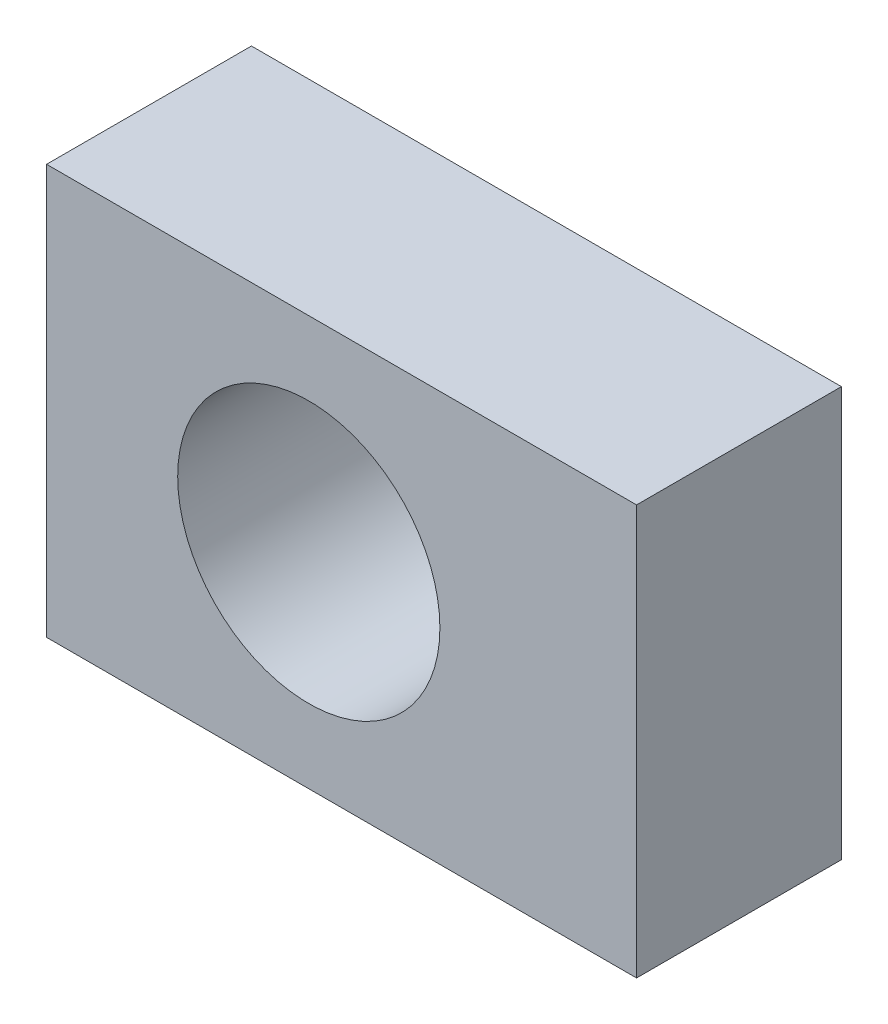
ISO-10303-21;
HEADER;
FILE_DESCRIPTION(('STEP AP214'),'2;1');
FILE_NAME('part.step','',(''),(''),'','','');
FILE_SCHEMA(('AUTOMOTIVE_DESIGN { 1 0 10303 214 1 1 1 1 }'));
ENDSEC;
DATA;
#1=APPLICATION_CONTEXT('core data for automotive mechanical design processes');
#2=APPLICATION_PROTOCOL_DEFINITION('international standard','automotive_design',2000,#1);
#3=PRODUCT_CONTEXT('',#1,'mechanical');
#4=PRODUCT('Part','Part','',(#3));
#5=PRODUCT_RELATED_PRODUCT_CATEGORY('part','',(#4));
#6=PRODUCT_DEFINITION_FORMATION('','',#4);
#7=PRODUCT_DEFINITION_CONTEXT('part definition',#1,'design');
#8=PRODUCT_DEFINITION('design','',#6,#7);
#9=PRODUCT_DEFINITION_SHAPE('','',#8);
#10=(LENGTH_UNIT() NAMED_UNIT(*) SI_UNIT(.MILLI.,.METRE.));
#11=(NAMED_UNIT(*) PLANE_ANGLE_UNIT() SI_UNIT($,.RADIAN.));
#12=(NAMED_UNIT(*) SI_UNIT($,.STERADIAN.) SOLID_ANGLE_UNIT());
#13=UNCERTAINTY_MEASURE_WITH_UNIT(LENGTH_MEASURE(1.E-05),#10,'distance_accuracy_value','');
#14=(GEOMETRIC_REPRESENTATION_CONTEXT(3) GLOBAL_UNCERTAINTY_ASSIGNED_CONTEXT((#13)) GLOBAL_UNIT_ASSIGNED_CONTEXT((#10,
#11,#12)) REPRESENTATION_CONTEXT('',''));
#15=CARTESIAN_POINT('',(0.,0.,0.));
#16=DIRECTION('',(0.,0.,1.));
#17=DIRECTION('',(1.,0.,0.));
#18=AXIS2_PLACEMENT_3D('',#15,#16,#17);
#19=CARTESIAN_POINT('',(0.,0.,3.175));
#20=DIRECTION('',(0.,0.,1.));
#21=DIRECTION('',(1.,0.,0.));
#22=AXIS2_PLACEMENT_3D('',#19,#20,#21);
#23=PLANE('',#22);
#24=DIRECTION('',(0.,-1.,0.));
#25=VECTOR('',#24,1.);
#26=CARTESIAN_POINT('',(0.,0.,3.175));
#27=LINE('',#26,#25);
#28=CARTESIAN_POINT('',(0.,0.,3.175));
#29=VERTEX_POINT('',#28);
#30=CARTESIAN_POINT('',(0.,-6.35,3.175));
#31=VERTEX_POINT('',#30);
#32=EDGE_CURVE('E85',#29,#31,#27,.T.);
#33=ORIENTED_EDGE('',*,*,#32,.T.);
#34=DIRECTION('',(1.,0.,0.));
#35=VECTOR('',#34,1.);
#36=CARTESIAN_POINT('',(0.,-6.35,3.175));
#37=LINE('',#36,#35);
#38=CARTESIAN_POINT('',(9.144,-6.35,3.175));
#39=VERTEX_POINT('',#38);
#40=EDGE_CURVE('E80',#31,#39,#37,.T.);
#41=ORIENTED_EDGE('',*,*,#40,.T.);
#42=DIRECTION('',(0.,1.,0.));
#43=VECTOR('',#42,1.);
#44=CARTESIAN_POINT('',(9.144,0.,3.175));
#45=LINE('',#44,#43);
#46=CARTESIAN_POINT('',(9.144,0.,3.175));
#47=VERTEX_POINT('',#46);
#48=EDGE_CURVE('E83',#39,#47,#45,.T.);
#49=ORIENTED_EDGE('',*,*,#48,.T.);
#50=DIRECTION('',(-1.,0.,0.));
#51=VECTOR('',#50,1.);
#52=CARTESIAN_POINT('',(0.,0.,3.175));
#53=LINE('',#52,#51);
#54=EDGE_CURVE('E50',#47,#29,#53,.T.);
#55=ORIENTED_EDGE('',*,*,#54,.T.);
#56=EDGE_LOOP('',(#33,#41,#49,#55));
#57=FACE_BOUND('',#56,.T.);
#58=CARTESIAN_POINT('',(4.064,-3.175,3.175));
#59=DIRECTION('',(0.,0.,1.));
#60=DIRECTION('',(1.,0.,0.));
#61=AXIS2_PLACEMENT_3D('',#58,#59,#60);
#62=CIRCLE('',#61,2.032);
#63=CARTESIAN_POINT('',(6.096,-3.175,3.175));
#64=VERTEX_POINT('',#63);
#65=EDGE_CURVE('E100',#64,#64,#62,.T.);
#66=ORIENTED_EDGE('',*,*,#65,.F.);
#67=EDGE_LOOP('',(#66));
#68=FACE_BOUND('',#67,.T.);
#69=ADVANCED_FACE('F33',(#57,#68),#23,.T.);
#70=CARTESIAN_POINT('',(0.,0.,0.));
#71=DIRECTION('',(0.,0.,1.));
#72=DIRECTION('',(1.,0.,0.));
#73=AXIS2_PLACEMENT_3D('',#70,#71,#72);
#74=PLANE('',#73);
#75=DIRECTION('',(0.,-1.,0.));
#76=VECTOR('',#75,1.);
#77=CARTESIAN_POINT('',(0.,0.,0.));
#78=LINE('',#77,#76);
#79=CARTESIAN_POINT('',(0.,0.,0.));
#80=VERTEX_POINT('',#79);
#81=CARTESIAN_POINT('',(0.,-6.35,0.));
#82=VERTEX_POINT('',#81);
#83=EDGE_CURVE('E97',#80,#82,#78,.T.);
#84=ORIENTED_EDGE('',*,*,#83,.F.);
#85=DIRECTION('',(-1.,0.,0.));
#86=VECTOR('',#85,1.);
#87=CARTESIAN_POINT('',(0.,0.,0.));
#88=LINE('',#87,#86);
#89=CARTESIAN_POINT('',(9.144,0.,0.));
#90=VERTEX_POINT('',#89);
#91=EDGE_CURVE('E73',#90,#80,#88,.T.);
#92=ORIENTED_EDGE('',*,*,#91,.F.);
#93=DIRECTION('',(0.,1.,0.));
#94=VECTOR('',#93,1.);
#95=CARTESIAN_POINT('',(9.144,0.,0.));
#96=LINE('',#95,#94);
#97=CARTESIAN_POINT('',(9.144,-6.35,0.));
#98=VERTEX_POINT('',#97);
#99=EDGE_CURVE('E67',#98,#90,#96,.T.);
#100=ORIENTED_EDGE('',*,*,#99,.F.);
#101=DIRECTION('',(1.,0.,0.));
#102=VECTOR('',#101,1.);
#103=CARTESIAN_POINT('',(0.,-6.35,0.));
#104=LINE('',#103,#102);
#105=EDGE_CURVE('E89',#82,#98,#104,.T.);
#106=ORIENTED_EDGE('',*,*,#105,.F.);
#107=EDGE_LOOP('',(#84,#92,#100,#106));
#108=FACE_BOUND('',#107,.T.);
#109=CARTESIAN_POINT('',(4.064,-3.175,0.));
#110=DIRECTION('',(0.,0.,1.));
#111=DIRECTION('',(1.,0.,0.));
#112=AXIS2_PLACEMENT_3D('',#109,#110,#111);
#113=CIRCLE('',#112,2.032);
#114=CARTESIAN_POINT('',(6.096,-3.175,0.));
#115=VERTEX_POINT('',#114);
#116=EDGE_CURVE('E112',#115,#115,#113,.T.);
#117=ORIENTED_EDGE('',*,*,#116,.T.);
#118=EDGE_LOOP('',(#117));
#119=FACE_BOUND('',#118,.T.);
#120=ADVANCED_FACE('F108',(#108,#119),#74,.F.);
#121=CARTESIAN_POINT('',(0.,0.,3.175));
#122=DIRECTION('',(1.,0.,0.));
#123=DIRECTION('',(0.,1.,0.));
#124=AXIS2_PLACEMENT_3D('',#121,#122,#123);
#125=PLANE('',#124);
#126=ORIENTED_EDGE('',*,*,#83,.T.);
#127=DIRECTION('',(0.,0.,-1.));
#128=VECTOR('',#127,1.);
#129=CARTESIAN_POINT('',(0.,-6.35,3.175));
#130=LINE('',#129,#128);
#131=EDGE_CURVE('E11',#31,#82,#130,.T.);
#132=ORIENTED_EDGE('',*,*,#131,.F.);
#133=ORIENTED_EDGE('',*,*,#32,.F.);
#134=DIRECTION('',(0.,0.,-1.));
#135=VECTOR('',#134,1.);
#136=CARTESIAN_POINT('',(0.,0.,3.175));
#137=LINE('',#136,#135);
#138=EDGE_CURVE('E93',#29,#80,#137,.T.);
#139=ORIENTED_EDGE('',*,*,#138,.T.);
#140=EDGE_LOOP('',(#126,#132,#133,#139));
#141=FACE_BOUND('',#140,.T.);
#142=ADVANCED_FACE('F35',(#141),#125,.F.);
#143=CARTESIAN_POINT('',(0.,-6.35,3.175));
#144=DIRECTION('',(0.,1.,0.));
#145=DIRECTION('',(0.,0.,1.));
#146=AXIS2_PLACEMENT_3D('',#143,#144,#145);
#147=PLANE('',#146);
#148=ORIENTED_EDGE('',*,*,#105,.T.);
#149=DIRECTION('',(0.,0.,-1.));
#150=VECTOR('',#149,1.);
#151=CARTESIAN_POINT('',(9.144,-6.35,3.175));
#152=LINE('',#151,#150);
#153=EDGE_CURVE('E42',#39,#98,#152,.T.);
#154=ORIENTED_EDGE('',*,*,#153,.F.);
#155=ORIENTED_EDGE('',*,*,#40,.F.);
#156=ORIENTED_EDGE('',*,*,#131,.T.);
#157=EDGE_LOOP('',(#148,#154,#155,#156));
#158=FACE_BOUND('',#157,.T.);
#159=ADVANCED_FACE('F88',(#158),#147,.F.);
#160=CARTESIAN_POINT('',(9.144,0.,3.175));
#161=DIRECTION('',(-1.,0.,0.));
#162=DIRECTION('',(0.,0.,1.));
#163=AXIS2_PLACEMENT_3D('',#160,#161,#162);
#164=PLANE('',#163);
#165=ORIENTED_EDGE('',*,*,#99,.T.);
#166=DIRECTION('',(0.,0.,-1.));
#167=VECTOR('',#166,1.);
#168=CARTESIAN_POINT('',(9.144,0.,3.175));
#169=LINE('',#168,#167);
#170=EDGE_CURVE('E90',#47,#90,#169,.T.);
#171=ORIENTED_EDGE('',*,*,#170,.F.);
#172=ORIENTED_EDGE('',*,*,#48,.F.);
#173=ORIENTED_EDGE('',*,*,#153,.T.);
#174=EDGE_LOOP('',(#165,#171,#172,#173));
#175=FACE_BOUND('',#174,.T.);
#176=ADVANCED_FACE('F91',(#175),#164,.F.);
#177=CARTESIAN_POINT('',(0.,0.,3.175));
#178=DIRECTION('',(0.,-1.,0.));
#179=DIRECTION('',(0.,0.,-1.));
#180=AXIS2_PLACEMENT_3D('',#177,#178,#179);
#181=PLANE('',#180);
#182=ORIENTED_EDGE('',*,*,#91,.T.);
#183=ORIENTED_EDGE('',*,*,#138,.F.);
#184=ORIENTED_EDGE('',*,*,#54,.F.);
#185=ORIENTED_EDGE('',*,*,#170,.T.);
#186=EDGE_LOOP('',(#182,#183,#184,#185));
#187=FACE_BOUND('',#186,.T.);
#188=ADVANCED_FACE('F105',(#187),#181,.F.);
#189=CARTESIAN_POINT('',(4.064,-3.175,3.175));
#190=DIRECTION('',(0.,0.,-1.));
#191=DIRECTION('',(-1.,0.,0.));
#192=AXIS2_PLACEMENT_3D('',#189,#190,#191);
#193=CYLINDRICAL_SURFACE('',#192,2.032);
#194=ORIENTED_EDGE('',*,*,#65,.T.);
#195=EDGE_LOOP('',(#194));
#196=FACE_BOUND('',#195,.T.);
#197=ORIENTED_EDGE('',*,*,#116,.F.);
#198=EDGE_LOOP('',(#197));
#199=FACE_BOUND('',#198,.T.);
#200=ADVANCED_FACE('F118',(#196,#199),#193,.F.);
#201=CLOSED_SHELL('',(#69,#120,#142,#159,#176,#188,#200));
#202=MANIFOLD_SOLID_BREP('B2',#201);
#203=ADVANCED_BREP_SHAPE_REPRESENTATION('',(#18,#202),#14);
#204=SHAPE_DEFINITION_REPRESENTATION(#9,#203);
ENDSEC;
END-ISO-10303-21;
